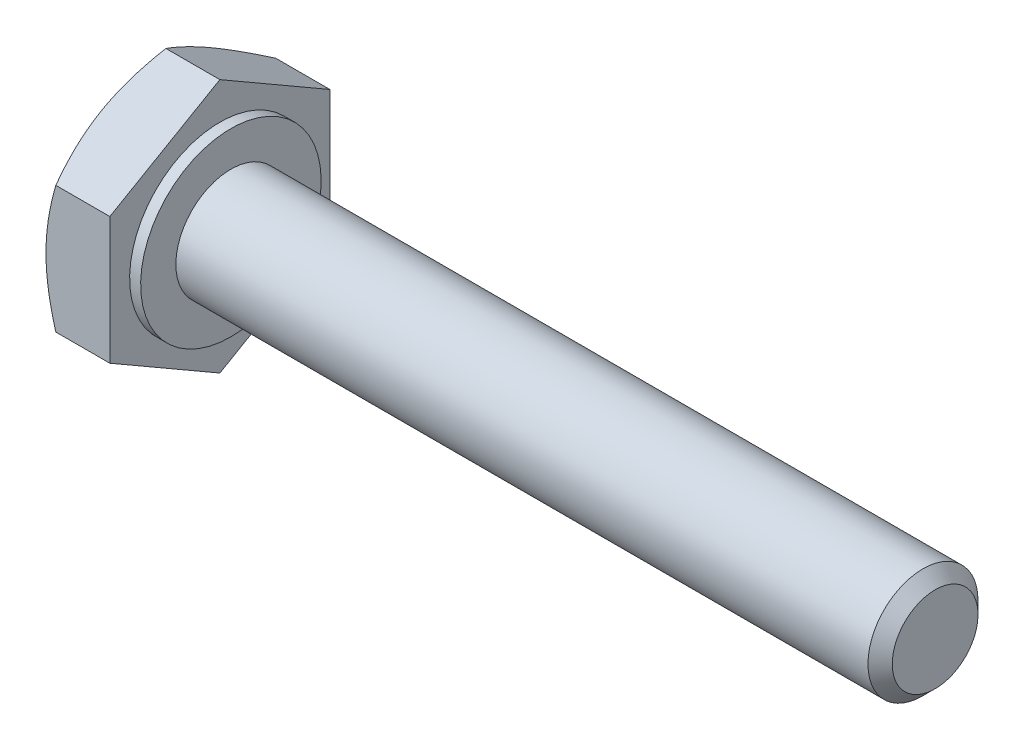
ISO-10303-21;
HEADER;
FILE_DESCRIPTION(('STEP AP214'),'2;1');
FILE_NAME('part.step','',(''),(''),'','','');
FILE_SCHEMA(('AUTOMOTIVE_DESIGN { 1 0 10303 214 1 1 1 1 }'));
ENDSEC;
DATA;
#1=APPLICATION_CONTEXT('core data for automotive mechanical design processes');
#2=APPLICATION_PROTOCOL_DEFINITION('international standard','automotive_design',2000,#1);
#3=PRODUCT_CONTEXT('',#1,'mechanical');
#4=PRODUCT('Part','Part','',(#3));
#5=PRODUCT_RELATED_PRODUCT_CATEGORY('part','',(#4));
#6=PRODUCT_DEFINITION_FORMATION('','',#4);
#7=PRODUCT_DEFINITION_CONTEXT('part definition',#1,'design');
#8=PRODUCT_DEFINITION('design','',#6,#7);
#9=PRODUCT_DEFINITION_SHAPE('','',#8);
#10=(LENGTH_UNIT() NAMED_UNIT(*) SI_UNIT(.MILLI.,.METRE.));
#11=(NAMED_UNIT(*) PLANE_ANGLE_UNIT() SI_UNIT($,.RADIAN.));
#12=(NAMED_UNIT(*) SI_UNIT($,.STERADIAN.) SOLID_ANGLE_UNIT());
#13=UNCERTAINTY_MEASURE_WITH_UNIT(LENGTH_MEASURE(1.E-05),#10,'distance_accuracy_value','');
#14=(GEOMETRIC_REPRESENTATION_CONTEXT(3) GLOBAL_UNCERTAINTY_ASSIGNED_CONTEXT((#13)) GLOBAL_UNIT_ASSIGNED_CONTEXT((#10,
#11,#12)) REPRESENTATION_CONTEXT('',''));
#15=CARTESIAN_POINT('',(0.,0.,0.));
#16=DIRECTION('',(0.,0.,1.));
#17=DIRECTION('',(1.,0.,0.));
#18=AXIS2_PLACEMENT_3D('',#15,#16,#17);
#19=CARTESIAN_POINT('',(0.,1.65,0.));
#20=DIRECTION('',(1.,0.,0.));
#21=DIRECTION('',(0.,1.,0.));
#22=AXIS2_PLACEMENT_3D('',#19,#20,#21);
#23=PLANE('',#22);
#24=CARTESIAN_POINT('',(0.,0.,0.));
#25=DIRECTION('',(1.,0.,0.));
#26=DIRECTION('',(0.,1.,0.));
#27=AXIS2_PLACEMENT_3D('',#24,#25,#26);
#28=CIRCLE('',#27,1.25);
#29=CARTESIAN_POINT('',(0.,-1.25,0.));
#30=VERTEX_POINT('',#29);
#31=EDGE_CURVE('E199',#30,#30,#28,.T.);
#32=ORIENTED_EDGE('',*,*,#31,.F.);
#33=EDGE_LOOP('',(#32));
#34=FACE_BOUND('',#33,.T.);
#35=CARTESIAN_POINT('',(0.,0.,0.));
#36=DIRECTION('',(1.,0.,0.));
#37=DIRECTION('',(0.,1.,0.));
#38=AXIS2_PLACEMENT_3D('',#35,#36,#37);
#39=CIRCLE('',#38,2.05);
#40=CARTESIAN_POINT('',(0.,-2.05,0.));
#41=VERTEX_POINT('',#40);
#42=EDGE_CURVE('E30',#41,#41,#39,.T.);
#43=ORIENTED_EDGE('',*,*,#42,.T.);
#44=EDGE_LOOP('',(#43));
#45=FACE_BOUND('',#44,.T.);
#46=ADVANCED_FACE('F17',(#34,#45),#23,.T.);
#47=CARTESIAN_POINT('',(-0.125049999999993,0.,0.));
#48=DIRECTION('',(1.,0.,0.));
#49=DIRECTION('',(0.,1.,0.));
#50=AXIS2_PLACEMENT_3D('',#47,#48,#49);
#51=CYLINDRICAL_SURFACE('',#50,2.05);
#52=ORIENTED_EDGE('',*,*,#42,.F.);
#53=DIRECTION('',(-1.,0.,0.));
#54=VECTOR('',#53,1.);
#55=CARTESIAN_POINT('',(-0.125049999999993,-2.05,0.));
#56=LINE('',#55,#54);
#57=CARTESIAN_POINT('',(-0.250099999999994,-2.05,0.));
#58=VERTEX_POINT('',#57);
#59=EDGE_CURVE('E11',#41,#58,#56,.T.);
#60=ORIENTED_EDGE('',*,*,#59,.T.);
#61=CARTESIAN_POINT('',(-0.250099999999993,0.,0.));
#62=DIRECTION('',(1.,0.,0.));
#63=DIRECTION('',(0.,1.,0.));
#64=AXIS2_PLACEMENT_3D('',#61,#62,#63);
#65=CIRCLE('',#64,2.05);
#66=EDGE_CURVE('E179',#58,#58,#65,.T.);
#67=ORIENTED_EDGE('',*,*,#66,.T.);
#68=ORIENTED_EDGE('',*,*,#59,.F.);
#69=EDGE_LOOP('',(#52,#60,#67,#68));
#70=FACE_BOUND('',#69,.T.);
#71=ADVANCED_FACE('F613',(#70),#51,.T.);
#72=CARTESIAN_POINT('',(-1.7001,0.,0.));
#73=DIRECTION('',(1.,0.,0.));
#74=DIRECTION('',(0.,1.,0.));
#75=AXIS2_PLACEMENT_3D('',#72,#73,#74);
#76=PLANE('',#75);
#77=CARTESIAN_POINT('',(-1.7001,0.,0.));
#78=DIRECTION('',(-1.,0.,0.));
#79=DIRECTION('',(0.,1.,0.));
#80=AXIS2_PLACEMENT_3D('',#77,#78,#79);
#81=CIRCLE('',#80,2.5);
#82=CARTESIAN_POINT('',(-1.7001,0.,2.5));
#83=VERTEX_POINT('',#82);
#84=CARTESIAN_POINT('',(-1.7001,2.16506350946109,1.25));
#85=VERTEX_POINT('',#84);
#86=EDGE_CURVE('E201',#83,#85,#81,.T.);
#87=ORIENTED_EDGE('',*,*,#86,.T.);
#88=CARTESIAN_POINT('',(-1.7001,0.,0.));
#89=DIRECTION('',(-1.,0.,0.));
#90=DIRECTION('',(0.,1.,0.));
#91=AXIS2_PLACEMENT_3D('',#88,#89,#90);
#92=CIRCLE('',#91,2.5);
#93=CARTESIAN_POINT('',(-1.7001,2.16506350946109,-1.25));
#94=VERTEX_POINT('',#93);
#95=EDGE_CURVE('E147',#85,#94,#92,.T.);
#96=ORIENTED_EDGE('',*,*,#95,.T.);
#97=CARTESIAN_POINT('',(-1.7001,0.,0.));
#98=DIRECTION('',(-1.,0.,0.));
#99=DIRECTION('',(0.,1.,0.));
#100=AXIS2_PLACEMENT_3D('',#97,#98,#99);
#101=CIRCLE('',#100,2.5);
#102=CARTESIAN_POINT('',(-1.7001,0.,-2.5));
#103=VERTEX_POINT('',#102);
#104=EDGE_CURVE('E227',#94,#103,#101,.T.);
#105=ORIENTED_EDGE('',*,*,#104,.T.);
#106=CARTESIAN_POINT('',(-1.7001,0.,0.));
#107=DIRECTION('',(-1.,0.,0.));
#108=DIRECTION('',(0.,1.,0.));
#109=AXIS2_PLACEMENT_3D('',#106,#107,#108);
#110=CIRCLE('',#109,2.5);
#111=CARTESIAN_POINT('',(-1.7001,-2.1650635094611,-1.25));
#112=VERTEX_POINT('',#111);
#113=EDGE_CURVE('E258',#103,#112,#110,.T.);
#114=ORIENTED_EDGE('',*,*,#113,.T.);
#115=CARTESIAN_POINT('',(-1.7001,0.,0.));
#116=DIRECTION('',(-1.,0.,0.));
#117=DIRECTION('',(0.,1.,0.));
#118=AXIS2_PLACEMENT_3D('',#115,#116,#117);
#119=CIRCLE('',#118,2.5);
#120=CARTESIAN_POINT('',(-1.7001,-2.1650635094611,1.25));
#121=VERTEX_POINT('',#120);
#122=EDGE_CURVE('E171',#112,#121,#119,.T.);
#123=ORIENTED_EDGE('',*,*,#122,.T.);
#124=CARTESIAN_POINT('',(-1.7001,0.,0.));
#125=DIRECTION('',(-1.,0.,0.));
#126=DIRECTION('',(0.,1.,0.));
#127=AXIS2_PLACEMENT_3D('',#124,#125,#126);
#128=CIRCLE('',#127,2.5);
#129=EDGE_CURVE('E157',#121,#83,#128,.T.);
#130=ORIENTED_EDGE('',*,*,#129,.T.);
#131=EDGE_LOOP('',(#87,#96,#105,#114,#123,#130));
#132=FACE_BOUND('',#131,.T.);
#133=ADVANCED_FACE('F605',(#132),#76,.F.);
#134=CARTESIAN_POINT('',(-0.250099999999995,-2.88675134594813,0.));
#135=DIRECTION('',(0.,-0.866025403784438,-0.5));
#136=DIRECTION('',(0.,0.5,-0.866025403784439));
#137=AXIS2_PLACEMENT_3D('',#134,#135,#136);
#138=PLANE('',#137);
#139=CARTESIAN_POINT('',(-1.7001,-2.1650635094611,-1.25));
#140=CARTESIAN_POINT('',(-1.70010000000001,-1.8301270189222,-1.83012701892218));
#141=CARTESIAN_POINT('',(-1.47680900630742,-1.44337567297408,-2.49999999999997));
#142=(BOUNDED_CURVE() B_SPLINE_CURVE(2,(#139,#140,#141),.UNSPECIFIED.,.F.,
.F.) B_SPLINE_CURVE_WITH_KNOTS((3,3),(0.146427429693808,0.292854859387615),
.UNSPECIFIED.) CURVE() GEOMETRIC_REPRESENTATION_ITEM() RATIONAL_B_SPLINE_CURVE((1.,
1.03795484930206,1.)) REPRESENTATION_ITEM(''));
#143=CARTESIAN_POINT('',(-1.47680900630742,-1.44337567297408,-2.49999999999997));
#144=VERTEX_POINT('',#143);
#145=EDGE_CURVE('E264',#112,#144,#142,.T.);
#146=ORIENTED_EDGE('',*,*,#145,.T.);
#147=DIRECTION('',(-1.,0.,0.));
#148=VECTOR('',#147,1.);
#149=CARTESIAN_POINT('',(-0.250099999999996,-1.44337567297406,-2.5));
#150=LINE('',#149,#148);
#151=CARTESIAN_POINT('',(-0.250099999999996,-1.44337567297406,-2.5));
#152=VERTEX_POINT('',#151);
#153=EDGE_CURVE('E140',#152,#144,#150,.T.);
#154=ORIENTED_EDGE('',*,*,#153,.F.);
#155=DIRECTION('',(0.,0.5,-0.866025403784438));
#156=VECTOR('',#155,1.);
#157=CARTESIAN_POINT('',(-0.250099999999995,-2.88675134594813,0.));
#158=LINE('',#157,#156);
#159=CARTESIAN_POINT('',(-0.250099999999995,-2.88675134594813,0.));
#160=VERTEX_POINT('',#159);
#161=EDGE_CURVE('E173',#160,#152,#158,.T.);
#162=ORIENTED_EDGE('',*,*,#161,.F.);
#163=DIRECTION('',(-1.,0.,0.));
#164=VECTOR('',#163,1.);
#165=CARTESIAN_POINT('',(-0.250099999999995,-2.88675134594813,0.));
#166=LINE('',#165,#164);
#167=CARTESIAN_POINT('',(-1.47680900630742,-2.88675134594811,0.));
#168=VERTEX_POINT('',#167);
#169=EDGE_CURVE('E189',#160,#168,#166,.T.);
#170=ORIENTED_EDGE('',*,*,#169,.T.);
#171=CARTESIAN_POINT('',(-1.47680900630742,-2.88675134594811,0.));
#172=CARTESIAN_POINT('',(-1.70010000000001,-2.49999999999999,-0.669872981077814));
#173=CARTESIAN_POINT('',(-1.7001,-2.1650635094611,-1.25));
#174=(BOUNDED_CURVE() B_SPLINE_CURVE(2,(#171,#172,#173),.UNSPECIFIED.,.F.,
.F.) B_SPLINE_CURVE_WITH_KNOTS((3,3),(0.,0.146427429693808),
.UNSPECIFIED.) CURVE() GEOMETRIC_REPRESENTATION_ITEM() RATIONAL_B_SPLINE_CURVE((1.,
1.03795484930207,1.)) REPRESENTATION_ITEM(''));
#175=EDGE_CURVE('E150',#168,#112,#174,.T.);
#176=ORIENTED_EDGE('',*,*,#175,.T.);
#177=EDGE_LOOP('',(#146,#154,#162,#170,#176));
#178=FACE_BOUND('',#177,.T.);
#179=ADVANCED_FACE('F597',(#178),#138,.T.);
#180=CARTESIAN_POINT('',(-0.250099999999996,-1.44337567297406,2.5));
#181=DIRECTION('',(0.,-0.866025403784439,0.5));
#182=DIRECTION('',(-1.,0.,0.));
#183=AXIS2_PLACEMENT_3D('',#180,#181,#182);
#184=PLANE('',#183);
#185=CARTESIAN_POINT('',(-1.7001,-2.1650635094611,1.25));
#186=CARTESIAN_POINT('',(-1.70010000000001,-2.49999999999999,0.669872981077814));
#187=CARTESIAN_POINT('',(-1.47680900630742,-2.88675134594811,0.));
#188=(BOUNDED_CURVE() B_SPLINE_CURVE(2,(#185,#186,#187),.UNSPECIFIED.,.F.,
.F.) B_SPLINE_CURVE_WITH_KNOTS((3,3),(0.146427429693808,0.292854859387616),
.UNSPECIFIED.) CURVE() GEOMETRIC_REPRESENTATION_ITEM() RATIONAL_B_SPLINE_CURVE((1.,
1.03795484930203,1.)) REPRESENTATION_ITEM(''));
#189=EDGE_CURVE('E213',#121,#168,#188,.T.);
#190=ORIENTED_EDGE('',*,*,#189,.T.);
#191=ORIENTED_EDGE('',*,*,#169,.F.);
#192=DIRECTION('',(0.,-0.5,-0.866025403784439));
#193=VECTOR('',#192,1.);
#194=CARTESIAN_POINT('',(-0.250099999999996,-1.44337567297406,2.5));
#195=LINE('',#194,#193);
#196=CARTESIAN_POINT('',(-0.250099999999996,-1.44337567297406,2.5));
#197=VERTEX_POINT('',#196);
#198=EDGE_CURVE('E180',#197,#160,#195,.T.);
#199=ORIENTED_EDGE('',*,*,#198,.F.);
#200=DIRECTION('',(-1.,0.,0.));
#201=VECTOR('',#200,1.);
#202=CARTESIAN_POINT('',(-0.250099999999996,-1.44337567297406,2.5));
#203=LINE('',#202,#201);
#204=CARTESIAN_POINT('',(-1.47680900630742,-1.44337567297404,2.5));
#205=VERTEX_POINT('',#204);
#206=EDGE_CURVE('E185',#197,#205,#203,.T.);
#207=ORIENTED_EDGE('',*,*,#206,.T.);
#208=CARTESIAN_POINT('',(-1.47680900630742,-1.44337567297408,2.49999999999997));
#209=CARTESIAN_POINT('',(-1.70010000000001,-1.8301270189222,1.83012701892218));
#210=CARTESIAN_POINT('',(-1.7001,-2.1650635094611,1.25));
#211=(BOUNDED_CURVE() B_SPLINE_CURVE(2,(#208,#209,#210),.UNSPECIFIED.,.F.,
.F.) B_SPLINE_CURVE_WITH_KNOTS((3,3),(0.,0.146427429693808),
.UNSPECIFIED.) CURVE() GEOMETRIC_REPRESENTATION_ITEM() RATIONAL_B_SPLINE_CURVE((1.,
1.03795484930204,1.)) REPRESENTATION_ITEM(''));
#212=EDGE_CURVE('E282',#205,#121,#211,.T.);
#213=ORIENTED_EDGE('',*,*,#212,.T.);
#214=EDGE_LOOP('',(#190,#191,#199,#207,#213));
#215=FACE_BOUND('',#214,.T.);
#216=ADVANCED_FACE('F343',(#215),#184,.T.);
#217=CARTESIAN_POINT('',(-0.2501,1.44337567297406,2.5));
#218=DIRECTION('',(0.,0.,1.));
#219=DIRECTION('',(0.,-1.,0.));
#220=AXIS2_PLACEMENT_3D('',#217,#218,#219);
#221=PLANE('',#220);
#222=CARTESIAN_POINT('',(-1.7001,0.,2.5));
#223=CARTESIAN_POINT('',(-1.70010000000001,-0.669872981077797,2.5));
#224=CARTESIAN_POINT('',(-1.47680900630742,-1.44337567297404,2.5));
#225=(BOUNDED_CURVE() B_SPLINE_CURVE(2,(#222,#223,#224),.UNSPECIFIED.,.F.,
.F.) B_SPLINE_CURVE_WITH_KNOTS((3,3),(0.146427429693808,0.292854859387615),
.UNSPECIFIED.) CURVE() GEOMETRIC_REPRESENTATION_ITEM() RATIONAL_B_SPLINE_CURVE((1.,
1.03795484930203,1.)) REPRESENTATION_ITEM(''));
#226=EDGE_CURVE('E165',#83,#205,#225,.T.);
#227=ORIENTED_EDGE('',*,*,#226,.T.);
#228=ORIENTED_EDGE('',*,*,#206,.F.);
#229=DIRECTION('',(0.,-1.,0.));
#230=VECTOR('',#229,1.);
#231=CARTESIAN_POINT('',(-0.2501,1.44337567297406,2.5));
#232=LINE('',#231,#230);
#233=CARTESIAN_POINT('',(-0.2501,1.44337567297406,2.5));
#234=VERTEX_POINT('',#233);
#235=EDGE_CURVE('E181',#234,#197,#232,.T.);
#236=ORIENTED_EDGE('',*,*,#235,.F.);
#237=DIRECTION('',(-1.,0.,0.));
#238=VECTOR('',#237,1.);
#239=CARTESIAN_POINT('',(-0.2501,1.44337567297406,2.5));
#240=LINE('',#239,#238);
#241=CARTESIAN_POINT('',(-1.47680900630742,1.44337567297403,2.5));
#242=VERTEX_POINT('',#241);
#243=EDGE_CURVE('E248',#234,#242,#240,.T.);
#244=ORIENTED_EDGE('',*,*,#243,.T.);
#245=CARTESIAN_POINT('',(-1.47680900630742,1.44337567297403,2.5));
#246=CARTESIAN_POINT('',(-1.70010000000001,0.669872981077794,2.5));
#247=CARTESIAN_POINT('',(-1.7001,0.,2.5));
#248=(BOUNDED_CURVE() B_SPLINE_CURVE(2,(#245,#246,#247),.UNSPECIFIED.,.F.,
.F.) B_SPLINE_CURVE_WITH_KNOTS((3,3),(0.,0.146427429693808),
.UNSPECIFIED.) CURVE() GEOMETRIC_REPRESENTATION_ITEM() RATIONAL_B_SPLINE_CURVE((1.,
1.03795484930203,1.)) REPRESENTATION_ITEM(''));
#249=EDGE_CURVE('E203',#242,#83,#248,.T.);
#250=ORIENTED_EDGE('',*,*,#249,.T.);
#251=EDGE_LOOP('',(#227,#228,#236,#244,#250));
#252=FACE_BOUND('',#251,.T.);
#253=ADVANCED_FACE('F334',(#252),#221,.T.);
#254=CARTESIAN_POINT('',(-0.250099999999996,0.,0.));
#255=DIRECTION('',(1.,0.,0.));
#256=DIRECTION('',(0.,1.,0.));
#257=AXIS2_PLACEMENT_3D('',#254,#255,#256);
#258=PLANE('',#257);
#259=ORIENTED_EDGE('',*,*,#66,.F.);
#260=EDGE_LOOP('',(#259));
#261=FACE_BOUND('',#260,.T.);
#262=DIRECTION('',(0.,-0.5,0.866025403784438));
#263=VECTOR('',#262,1.);
#264=CARTESIAN_POINT('',(-0.2501,2.88675134594813,0.));
#265=LINE('',#264,#263);
#266=CARTESIAN_POINT('',(-0.2501,2.88675134594813,0.));
#267=VERTEX_POINT('',#266);
#268=EDGE_CURVE('E133',#267,#234,#265,.T.);
#269=ORIENTED_EDGE('',*,*,#268,.T.);
#270=ORIENTED_EDGE('',*,*,#235,.T.);
#271=ORIENTED_EDGE('',*,*,#198,.T.);
#272=ORIENTED_EDGE('',*,*,#161,.T.);
#273=DIRECTION('',(0.,1.,0.));
#274=VECTOR('',#273,1.);
#275=CARTESIAN_POINT('',(-0.250099999999996,-1.44337567297406,-2.5));
#276=LINE('',#275,#274);
#277=CARTESIAN_POINT('',(-0.2501,1.44337567297406,-2.5));
#278=VERTEX_POINT('',#277);
#279=EDGE_CURVE('E190',#152,#278,#276,.T.);
#280=ORIENTED_EDGE('',*,*,#279,.T.);
#281=DIRECTION('',(0.,0.5,0.866025403784439));
#282=VECTOR('',#281,1.);
#283=CARTESIAN_POINT('',(-0.2501,1.44337567297406,-2.5));
#284=LINE('',#283,#282);
#285=EDGE_CURVE('E139',#278,#267,#284,.T.);
#286=ORIENTED_EDGE('',*,*,#285,.T.);
#287=EDGE_LOOP('',(#269,#270,#271,#272,#280,#286));
#288=FACE_BOUND('',#287,.T.);
#289=ADVANCED_FACE('F348',(#261,#288),#258,.T.);
#290=CARTESIAN_POINT('',(-0.2501,2.88675134594813,0.));
#291=DIRECTION('',(0.,0.866025403784438,0.5));
#292=DIRECTION('',(1.,0.,0.));
#293=AXIS2_PLACEMENT_3D('',#290,#291,#292);
#294=PLANE('',#293);
#295=CARTESIAN_POINT('',(-1.47680900630742,2.88675134594811,0.));
#296=CARTESIAN_POINT('',(-1.70010000000001,2.49999999999999,0.669872981077814));
#297=CARTESIAN_POINT('',(-1.7001,2.16506350946109,1.25));
#298=(BOUNDED_CURVE() B_SPLINE_CURVE(2,(#295,#296,#297),.UNSPECIFIED.,.F.,
.F.) B_SPLINE_CURVE_WITH_KNOTS((3,3),(0.,0.146427429693808),
.UNSPECIFIED.) CURVE() GEOMETRIC_REPRESENTATION_ITEM() RATIONAL_B_SPLINE_CURVE((1.,
1.03795484930204,1.)) REPRESENTATION_ITEM(''));
#299=CARTESIAN_POINT('',(-1.47680900630742,2.88675134594811,0.));
#300=VERTEX_POINT('',#299);
#301=EDGE_CURVE('E129',#300,#85,#298,.T.);
#302=ORIENTED_EDGE('',*,*,#301,.T.);
#303=CARTESIAN_POINT('',(-1.7001,2.16506350946109,1.25));
#304=CARTESIAN_POINT('',(-1.70010000000001,1.83012701892219,1.83012701892218));
#305=CARTESIAN_POINT('',(-1.47680900630742,1.44337567297407,2.5));
#306=(BOUNDED_CURVE() B_SPLINE_CURVE(2,(#303,#304,#305),.UNSPECIFIED.,.F.,
.F.) B_SPLINE_CURVE_WITH_KNOTS((3,3),(0.146427429693808,0.292854859387616),
.UNSPECIFIED.) CURVE() GEOMETRIC_REPRESENTATION_ITEM() RATIONAL_B_SPLINE_CURVE((1.,
1.03795484930202,1.)) REPRESENTATION_ITEM(''));
#307=EDGE_CURVE('E21',#85,#242,#306,.T.);
#308=ORIENTED_EDGE('',*,*,#307,.T.);
#309=ORIENTED_EDGE('',*,*,#243,.F.);
#310=ORIENTED_EDGE('',*,*,#268,.F.);
#311=DIRECTION('',(-1.,0.,0.));
#312=VECTOR('',#311,1.);
#313=CARTESIAN_POINT('',(-0.2501,2.88675134594813,0.));
#314=LINE('',#313,#312);
#315=EDGE_CURVE('E125',#267,#300,#314,.T.);
#316=ORIENTED_EDGE('',*,*,#315,.T.);
#317=EDGE_LOOP('',(#302,#308,#309,#310,#316));
#318=FACE_BOUND('',#317,.T.);
#319=ADVANCED_FACE('F127',(#318),#294,.T.);
#320=CARTESIAN_POINT('',(-0.2501,1.44337567297406,-2.5));
#321=DIRECTION('',(0.,0.866025403784439,-0.5));
#322=DIRECTION('',(-1.,0.,0.));
#323=AXIS2_PLACEMENT_3D('',#320,#321,#322);
#324=PLANE('',#323);
#325=CARTESIAN_POINT('',(-1.47680900630742,1.44337567297408,-2.5));
#326=CARTESIAN_POINT('',(-1.70010000000001,1.83012701892219,-1.83012701892218));
#327=CARTESIAN_POINT('',(-1.7001,2.16506350946109,-1.25));
#328=(BOUNDED_CURVE() B_SPLINE_CURVE(2,(#325,#326,#327),.UNSPECIFIED.,.F.,
.F.) B_SPLINE_CURVE_WITH_KNOTS((3,3),(0.,0.146427429693808),
.UNSPECIFIED.) CURVE() GEOMETRIC_REPRESENTATION_ITEM() RATIONAL_B_SPLINE_CURVE((1.,
1.03795484930202,1.)) REPRESENTATION_ITEM(''));
#329=CARTESIAN_POINT('',(-1.47680900630742,1.44337567297403,-2.5));
#330=VERTEX_POINT('',#329);
#331=EDGE_CURVE('E154',#330,#94,#328,.T.);
#332=ORIENTED_EDGE('',*,*,#331,.T.);
#333=CARTESIAN_POINT('',(-1.7001,2.16506350946109,-1.25));
#334=CARTESIAN_POINT('',(-1.70010000000001,2.49999999999999,-0.669872981077814));
#335=CARTESIAN_POINT('',(-1.47680900630742,2.88675134594811,0.));
#336=(BOUNDED_CURVE() B_SPLINE_CURVE(2,(#333,#334,#335),.UNSPECIFIED.,.F.,
.F.) B_SPLINE_CURVE_WITH_KNOTS((3,3),(0.146427429693808,0.292854859387616),
.UNSPECIFIED.) CURVE() GEOMETRIC_REPRESENTATION_ITEM() RATIONAL_B_SPLINE_CURVE((1.,
1.03795484930203,1.)) REPRESENTATION_ITEM(''));
#337=EDGE_CURVE('E145',#94,#300,#336,.T.);
#338=ORIENTED_EDGE('',*,*,#337,.T.);
#339=ORIENTED_EDGE('',*,*,#315,.F.);
#340=ORIENTED_EDGE('',*,*,#285,.F.);
#341=DIRECTION('',(-1.,0.,0.));
#342=VECTOR('',#341,1.);
#343=CARTESIAN_POINT('',(-0.2501,1.44337567297406,-2.5));
#344=LINE('',#343,#342);
#345=EDGE_CURVE('E194',#278,#330,#344,.T.);
#346=ORIENTED_EDGE('',*,*,#345,.T.);
#347=EDGE_LOOP('',(#332,#338,#339,#340,#346));
#348=FACE_BOUND('',#347,.T.);
#349=ADVANCED_FACE('F19',(#348),#324,.T.);
#350=CARTESIAN_POINT('',(-0.250099999999996,-1.44337567297406,-2.5));
#351=DIRECTION('',(0.,0.,-1.));
#352=DIRECTION('',(-1.,0.,0.));
#353=AXIS2_PLACEMENT_3D('',#350,#351,#352);
#354=PLANE('',#353);
#355=CARTESIAN_POINT('',(-1.47680900630742,-1.44337567297403,-2.5));
#356=CARTESIAN_POINT('',(-1.70010000000001,-0.669872981077796,-2.5));
#357=CARTESIAN_POINT('',(-1.7001,0.,-2.5));
#358=(BOUNDED_CURVE() B_SPLINE_CURVE(2,(#355,#356,#357),.UNSPECIFIED.,.F.,
.F.) B_SPLINE_CURVE_WITH_KNOTS((3,3),(0.,0.146427429693808),
.UNSPECIFIED.) CURVE() GEOMETRIC_REPRESENTATION_ITEM() RATIONAL_B_SPLINE_CURVE((1.,
1.03795484930204,1.)) REPRESENTATION_ITEM(''));
#359=EDGE_CURVE('E257',#144,#103,#358,.T.);
#360=ORIENTED_EDGE('',*,*,#359,.T.);
#361=CARTESIAN_POINT('',(-1.7001,0.,-2.5));
#362=CARTESIAN_POINT('',(-1.70010000000001,0.669872981077797,-2.5));
#363=CARTESIAN_POINT('',(-1.47680900630742,1.44337567297404,-2.5));
#364=(BOUNDED_CURVE() B_SPLINE_CURVE(2,(#361,#362,#363),.UNSPECIFIED.,.F.,
.F.) B_SPLINE_CURVE_WITH_KNOTS((3,3),(0.146427429693808,0.292854859387616),
.UNSPECIFIED.) CURVE() GEOMETRIC_REPRESENTATION_ITEM() RATIONAL_B_SPLINE_CURVE((1.,
1.03795484930203,1.)) REPRESENTATION_ITEM(''));
#365=EDGE_CURVE('E219',#103,#330,#364,.T.);
#366=ORIENTED_EDGE('',*,*,#365,.T.);
#367=ORIENTED_EDGE('',*,*,#345,.F.);
#368=ORIENTED_EDGE('',*,*,#279,.F.);
#369=ORIENTED_EDGE('',*,*,#153,.T.);
#370=EDGE_LOOP('',(#360,#366,#367,#368,#369));
#371=FACE_BOUND('',#370,.T.);
#372=ADVANCED_FACE('F551',(#371),#354,.T.);
#373=CARTESIAN_POINT('',(-1.58845450315372,0.,0.));
#374=DIRECTION('',(1.,0.,0.));
#375=DIRECTION('',(0.,1.,0.));
#376=AXIS2_PLACEMENT_3D('',#373,#374,#375);
#377=CONICAL_SURFACE('',#376,2.69337567297406,1.0471975511966);
#378=ORIENTED_EDGE('',*,*,#359,.F.);
#379=ORIENTED_EDGE('',*,*,#145,.F.);
#380=ORIENTED_EDGE('',*,*,#113,.F.);
#381=EDGE_LOOP('',(#378,#379,#380));
#382=FACE_BOUND('',#381,.T.);
#383=ADVANCED_FACE('F540',(#382),#377,.T.);
#384=CARTESIAN_POINT('',(-1.58845450315372,0.,0.));
#385=DIRECTION('',(1.,0.,0.));
#386=DIRECTION('',(0.,1.,0.));
#387=AXIS2_PLACEMENT_3D('',#384,#385,#386);
#388=CONICAL_SURFACE('',#387,2.69337567297406,1.0471975511966);
#389=ORIENTED_EDGE('',*,*,#365,.F.);
#390=ORIENTED_EDGE('',*,*,#104,.F.);
#391=ORIENTED_EDGE('',*,*,#331,.F.);
#392=EDGE_LOOP('',(#389,#390,#391));
#393=FACE_BOUND('',#392,.T.);
#394=ADVANCED_FACE('F530',(#393),#388,.T.);
#395=CARTESIAN_POINT('',(-1.58845450315372,0.,0.));
#396=DIRECTION('',(1.,0.,0.));
#397=DIRECTION('',(0.,-1.,0.));
#398=AXIS2_PLACEMENT_3D('',#395,#396,#397);
#399=CONICAL_SURFACE('',#398,2.69337567297406,1.0471975511966);
#400=ORIENTED_EDGE('',*,*,#175,.F.);
#401=ORIENTED_EDGE('',*,*,#189,.F.);
#402=ORIENTED_EDGE('',*,*,#122,.F.);
#403=EDGE_LOOP('',(#400,#401,#402));
#404=FACE_BOUND('',#403,.T.);
#405=ADVANCED_FACE('F521',(#404),#399,.T.);
#406=CARTESIAN_POINT('',(-1.58845450315372,0.,0.));
#407=DIRECTION('',(1.,0.,0.));
#408=DIRECTION('',(0.,1.,0.));
#409=AXIS2_PLACEMENT_3D('',#406,#407,#408);
#410=CONICAL_SURFACE('',#409,2.69337567297406,1.0471975511966);
#411=ORIENTED_EDGE('',*,*,#337,.F.);
#412=ORIENTED_EDGE('',*,*,#95,.F.);
#413=ORIENTED_EDGE('',*,*,#301,.F.);
#414=EDGE_LOOP('',(#411,#412,#413));
#415=FACE_BOUND('',#414,.T.);
#416=ADVANCED_FACE('F144',(#415),#410,.T.);
#417=CARTESIAN_POINT('',(-1.58845450315372,0.,0.));
#418=DIRECTION('',(1.,0.,0.));
#419=DIRECTION('',(0.,1.,0.));
#420=AXIS2_PLACEMENT_3D('',#417,#418,#419);
#421=CONICAL_SURFACE('',#420,2.69337567297406,1.0471975511966);
#422=ORIENTED_EDGE('',*,*,#212,.F.);
#423=ORIENTED_EDGE('',*,*,#226,.F.);
#424=ORIENTED_EDGE('',*,*,#129,.F.);
#425=EDGE_LOOP('',(#422,#423,#424));
#426=FACE_BOUND('',#425,.T.);
#427=ADVANCED_FACE('F341',(#426),#421,.T.);
#428=CARTESIAN_POINT('',(-1.58845450315372,0.,0.));
#429=DIRECTION('',(1.,0.,0.));
#430=DIRECTION('',(0.,1.,0.));
#431=AXIS2_PLACEMENT_3D('',#428,#429,#430);
#432=CONICAL_SURFACE('',#431,2.69337567297406,1.0471975511966);
#433=ORIENTED_EDGE('',*,*,#307,.F.);
#434=ORIENTED_EDGE('',*,*,#86,.F.);
#435=ORIENTED_EDGE('',*,*,#249,.F.);
#436=EDGE_LOOP('',(#433,#434,#435));
#437=FACE_BOUND('',#436,.T.);
#438=ADVANCED_FACE('F351',(#437),#432,.T.);
#439=CARTESIAN_POINT('',(16.,0.625,0.));
#440=DIRECTION('',(1.,0.,0.));
#441=DIRECTION('',(0.,1.,0.));
#442=AXIS2_PLACEMENT_3D('',#439,#440,#441);
#443=PLANE('',#442);
#444=CARTESIAN_POINT('',(16.,0.,0.));
#445=DIRECTION('',(-1.,0.,0.));
#446=DIRECTION('',(0.,-1.,0.));
#447=AXIS2_PLACEMENT_3D('',#444,#445,#446);
#448=CIRCLE('',#447,0.9739475);
#449=CARTESIAN_POINT('',(16.,0.9739475,0.));
#450=VERTEX_POINT('',#449);
#451=EDGE_CURVE('E276',#450,#450,#448,.T.);
#452=ORIENTED_EDGE('',*,*,#451,.F.);
#453=EDGE_LOOP('',(#452));
#454=FACE_BOUND('',#453,.T.);
#455=ADVANCED_FACE('F482',(#454),#443,.T.);
#456=CARTESIAN_POINT('',(10.5,0.,0.));
#457=DIRECTION('',(1.,0.,0.));
#458=DIRECTION('',(0.,1.,0.));
#459=AXIS2_PLACEMENT_3D('',#456,#457,#458);
#460=CYLINDRICAL_SURFACE('',#459,1.25);
#461=CARTESIAN_POINT('',(15.7238475,0.,0.));
#462=DIRECTION('',(1.,0.,0.));
#463=DIRECTION('',(0.,-1.,0.));
#464=AXIS2_PLACEMENT_3D('',#461,#462,#463);
#465=CIRCLE('',#464,1.25);
#466=CARTESIAN_POINT('',(15.7238475,1.25,0.));
#467=VERTEX_POINT('',#466);
#468=CARTESIAN_POINT('',(15.7238475,-1.25,0.));
#469=VERTEX_POINT('',#468);
#470=EDGE_CURVE('E234',#467,#469,#465,.T.);
#471=ORIENTED_EDGE('',*,*,#470,.F.);
#472=CARTESIAN_POINT('',(15.7238475,0.,0.));
#473=DIRECTION('',(1.,0.,0.));
#474=DIRECTION('',(0.,-1.,0.));
#475=AXIS2_PLACEMENT_3D('',#472,#473,#474);
#476=CIRCLE('',#475,1.25);
#477=EDGE_CURVE('E200',#469,#467,#476,.T.);
#478=ORIENTED_EDGE('',*,*,#477,.F.);
#479=DIRECTION('',(-1.,0.,0.));
#480=VECTOR('',#479,1.);
#481=CARTESIAN_POINT('',(10.5,-1.25,0.));
#482=LINE('',#481,#480);
#483=EDGE_CURVE('E195',#469,#30,#482,.T.);
#484=ORIENTED_EDGE('',*,*,#483,.T.);
#485=ORIENTED_EDGE('',*,*,#31,.T.);
#486=ORIENTED_EDGE('',*,*,#483,.F.);
#487=EDGE_LOOP('',(#471,#478,#484,#485,#486));
#488=FACE_BOUND('',#487,.T.);
#489=ADVANCED_FACE('F469',(#488),#460,.T.);
#490=CARTESIAN_POINT('',(15.86192375,0.,0.));
#491=DIRECTION('',(-1.,0.,0.));
#492=DIRECTION('',(0.,-1.,0.));
#493=AXIS2_PLACEMENT_3D('',#490,#491,#492);
#494=CONICAL_SURFACE('',#493,1.11197375,0.785217071232573);
#495=ORIENTED_EDGE('',*,*,#451,.T.);
#496=DIRECTION('',(-0.70723482108909,0.706978718094882,0.));
#497=VECTOR('',#496,1.);
#498=CARTESIAN_POINT('',(15.86192375,1.11197375,0.));
#499=LINE('',#498,#497);
#500=EDGE_CURVE('E272',#450,#467,#499,.T.);
#501=ORIENTED_EDGE('',*,*,#500,.T.);
#502=ORIENTED_EDGE('',*,*,#470,.T.);
#503=ORIENTED_EDGE('',*,*,#477,.T.);
#504=ORIENTED_EDGE('',*,*,#500,.F.);
#505=EDGE_LOOP('',(#495,#501,#502,#503,#504));
#506=FACE_BOUND('',#505,.T.);
#507=ADVANCED_FACE('F454',(#506),#494,.T.);
#508=CLOSED_SHELL('',(#46,#71,#133,#179,#216,#253,#289,#319,#349,#372,#383,#394,#405,#416,#427,
#438,#455,#489,#507));
#509=MANIFOLD_SOLID_BREP('B1',#508);
#510=ADVANCED_BREP_SHAPE_REPRESENTATION('',(#18,#509),#14);
#511=SHAPE_DEFINITION_REPRESENTATION(#9,#510);
ENDSEC;
END-ISO-10303-21;
